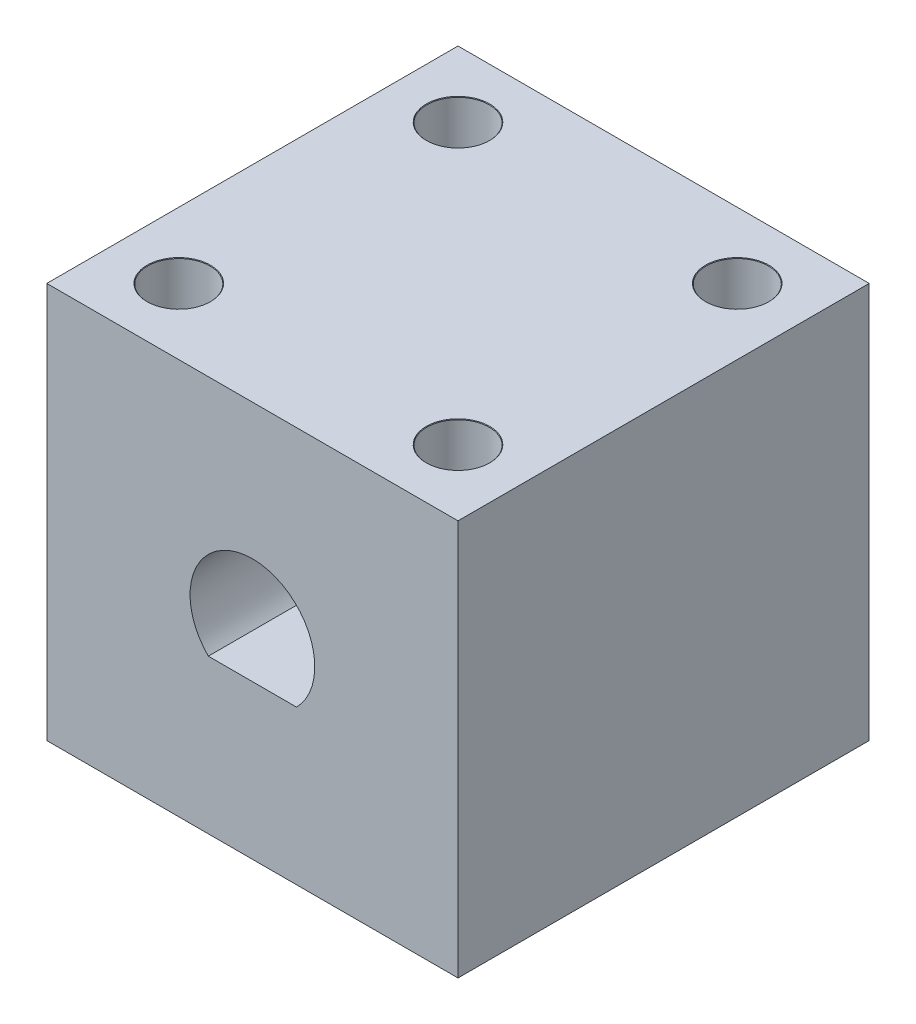
ISO-10303-21;
HEADER;
FILE_DESCRIPTION(('STEP AP214'),'2;1');
FILE_NAME('part.step','',(''),(''),'','','');
FILE_SCHEMA(('AUTOMOTIVE_DESIGN { 1 0 10303 214 1 1 1 1 }'));
ENDSEC;
DATA;
#1=APPLICATION_CONTEXT('core data for automotive mechanical design processes');
#2=APPLICATION_PROTOCOL_DEFINITION('international standard','automotive_design',2000,#1);
#3=PRODUCT_CONTEXT('',#1,'mechanical');
#4=PRODUCT('Part','Part','',(#3));
#5=PRODUCT_RELATED_PRODUCT_CATEGORY('part','',(#4));
#6=PRODUCT_DEFINITION_FORMATION('','',#4);
#7=PRODUCT_DEFINITION_CONTEXT('part definition',#1,'design');
#8=PRODUCT_DEFINITION('design','',#6,#7);
#9=PRODUCT_DEFINITION_SHAPE('','',#8);
#10=(LENGTH_UNIT() NAMED_UNIT(*) SI_UNIT(.MILLI.,.METRE.));
#11=(NAMED_UNIT(*) PLANE_ANGLE_UNIT() SI_UNIT($,.RADIAN.));
#12=(NAMED_UNIT(*) SI_UNIT($,.STERADIAN.) SOLID_ANGLE_UNIT());
#13=UNCERTAINTY_MEASURE_WITH_UNIT(LENGTH_MEASURE(1.E-05),#10,'distance_accuracy_value','');
#14=(GEOMETRIC_REPRESENTATION_CONTEXT(3) GLOBAL_UNCERTAINTY_ASSIGNED_CONTEXT((#13)) GLOBAL_UNIT_ASSIGNED_CONTEXT((#10,
#11,#12)) REPRESENTATION_CONTEXT('',''));
#15=CARTESIAN_POINT('',(0.,0.,0.));
#16=DIRECTION('',(0.,0.,1.));
#17=DIRECTION('',(1.,0.,0.));
#18=AXIS2_PLACEMENT_3D('',#15,#16,#17);
#19=CARTESIAN_POINT('',(472.707485578728,66.6749999999999,-304.699971157455));
#20=DIRECTION('',(0.,0.,-1.));
#21=DIRECTION('',(-1.,0.,0.));
#22=AXIS2_PLACEMENT_3D('',#19,#20,#21);
#23=PLANE('',#22);
#24=CARTESIAN_POINT('',(482.6,57.15,-304.699971157455));
#25=DIRECTION('',(0.,0.,-1.));
#26=DIRECTION('',(-1.,0.,0.));
#27=AXIS2_PLACEMENT_3D('',#24,#25,#26);
#28=CIRCLE('',#27,2.99999999999999);
#29=CARTESIAN_POINT('',(480.47867965644,55.0286796564404,-304.699971157455));
#30=VERTEX_POINT('',#29);
#31=CARTESIAN_POINT('',(484.72132034356,55.0286796564404,-304.699971157455));
#32=VERTEX_POINT('',#31);
#33=EDGE_CURVE('E112',#30,#32,#28,.T.);
#34=ORIENTED_EDGE('',*,*,#33,.T.);
#35=DIRECTION('',(-1.,0.,0.));
#36=VECTOR('',#35,1.);
#37=CARTESIAN_POINT('',(472.707485578728,55.0286796564404,-304.699971157455));
#38=LINE('',#37,#36);
#39=EDGE_CURVE('E99',#32,#30,#38,.T.);
#40=ORIENTED_EDGE('',*,*,#39,.T.);
#41=EDGE_LOOP('',(#34,#40));
#42=FACE_BOUND('',#41,.T.);
#43=DIRECTION('',(1.,0.,0.));
#44=VECTOR('',#43,1.);
#45=CARTESIAN_POINT('',(472.707485578728,47.6249999999999,-304.699971157455));
#46=LINE('',#45,#44);
#47=CARTESIAN_POINT('',(472.707485578728,47.6249999999999,-304.699971157455));
#48=VERTEX_POINT('',#47);
#49=CARTESIAN_POINT('',(492.492514421272,47.6249999999999,-304.699971157455));
#50=VERTEX_POINT('',#49);
#51=EDGE_CURVE('E154',#48,#50,#46,.T.);
#52=ORIENTED_EDGE('',*,*,#51,.T.);
#53=DIRECTION('',(0.,-1.,0.));
#54=VECTOR('',#53,1.);
#55=CARTESIAN_POINT('',(492.492514421272,66.6749999999999,-304.699971157455));
#56=LINE('',#55,#54);
#57=CARTESIAN_POINT('',(492.492514421272,66.6749999999999,-304.699971157455));
#58=VERTEX_POINT('',#57);
#59=EDGE_CURVE('E11',#58,#50,#56,.T.);
#60=ORIENTED_EDGE('',*,*,#59,.F.);
#61=DIRECTION('',(1.,0.,0.));
#62=VECTOR('',#61,1.);
#63=CARTESIAN_POINT('',(472.707485578728,66.6749999999999,-304.699971157455));
#64=LINE('',#63,#62);
#65=CARTESIAN_POINT('',(472.707485578728,66.6749999999999,-304.699971157455));
#66=VERTEX_POINT('',#65);
#67=EDGE_CURVE('E143',#66,#58,#64,.T.);
#68=ORIENTED_EDGE('',*,*,#67,.F.);
#69=DIRECTION('',(0.,-1.,0.));
#70=VECTOR('',#69,1.);
#71=CARTESIAN_POINT('',(472.707485578728,66.6749999999999,-304.699971157455));
#72=LINE('',#71,#70);
#73=EDGE_CURVE('E153',#66,#48,#72,.T.);
#74=ORIENTED_EDGE('',*,*,#73,.T.);
#75=EDGE_LOOP('',(#52,#60,#68,#74));
#76=FACE_BOUND('',#75,.T.);
#77=ADVANCED_FACE('F45',(#42,#76),#23,.F.);
#78=CARTESIAN_POINT('',(492.492514421272,66.6749999999999,-304.699971157455));
#79=DIRECTION('',(-1.,0.,0.));
#80=DIRECTION('',(0.,0.,1.));
#81=AXIS2_PLACEMENT_3D('',#78,#79,#80);
#82=PLANE('',#81);
#83=DIRECTION('',(0.,0.,-1.));
#84=VECTOR('',#83,1.);
#85=CARTESIAN_POINT('',(492.492514421272,47.6249999999999,-304.699971157455));
#86=LINE('',#85,#84);
#87=CARTESIAN_POINT('',(492.492514421272,47.6249999999999,-324.485));
#88=VERTEX_POINT('',#87);
#89=EDGE_CURVE('E157',#50,#88,#86,.T.);
#90=ORIENTED_EDGE('',*,*,#89,.T.);
#91=DIRECTION('',(0.,-1.,0.));
#92=VECTOR('',#91,1.);
#93=CARTESIAN_POINT('',(492.492514421272,66.6749999999999,-324.485));
#94=LINE('',#93,#92);
#95=CARTESIAN_POINT('',(492.492514421272,66.6749999999999,-324.485));
#96=VERTEX_POINT('',#95);
#97=EDGE_CURVE('E53',#96,#88,#94,.T.);
#98=ORIENTED_EDGE('',*,*,#97,.F.);
#99=DIRECTION('',(0.,0.,-1.));
#100=VECTOR('',#99,1.);
#101=CARTESIAN_POINT('',(492.492514421272,66.6749999999999,-304.699971157455));
#102=LINE('',#101,#100);
#103=EDGE_CURVE('E146',#58,#96,#102,.T.);
#104=ORIENTED_EDGE('',*,*,#103,.F.);
#105=ORIENTED_EDGE('',*,*,#59,.T.);
#106=EDGE_LOOP('',(#90,#98,#104,#105));
#107=FACE_BOUND('',#106,.T.);
#108=ADVANCED_FACE('F195',(#107),#82,.F.);
#109=CARTESIAN_POINT('',(472.707485578728,66.6749999999999,-324.485));
#110=DIRECTION('',(0.,0.,1.));
#111=DIRECTION('',(1.,0.,0.));
#112=AXIS2_PLACEMENT_3D('',#109,#110,#111);
#113=PLANE('',#112);
#114=CARTESIAN_POINT('',(482.6,57.15,-324.485));
#115=DIRECTION('',(0.,0.,1.));
#116=DIRECTION('',(1.,0.,0.));
#117=AXIS2_PLACEMENT_3D('',#114,#115,#116);
#118=CIRCLE('',#117,2.99999999999999);
#119=CARTESIAN_POINT('',(484.72132034356,55.0286796564403,-324.485));
#120=VERTEX_POINT('',#119);
#121=CARTESIAN_POINT('',(480.47867965644,55.0286796564404,-324.485));
#122=VERTEX_POINT('',#121);
#123=EDGE_CURVE('E102',#120,#122,#118,.T.);
#124=ORIENTED_EDGE('',*,*,#123,.T.);
#125=DIRECTION('',(1.,0.,0.));
#126=VECTOR('',#125,1.);
#127=CARTESIAN_POINT('',(4.50000598645352E-13,55.0286796564443,-324.485));
#128=LINE('',#127,#126);
#129=EDGE_CURVE('E68',#122,#120,#128,.T.);
#130=ORIENTED_EDGE('',*,*,#129,.T.);
#131=EDGE_LOOP('',(#124,#130));
#132=FACE_BOUND('',#131,.T.);
#133=DIRECTION('',(-1.,0.,0.));
#134=VECTOR('',#133,1.);
#135=CARTESIAN_POINT('',(472.707485578728,47.6249999999999,-324.485));
#136=LINE('',#135,#134);
#137=CARTESIAN_POINT('',(472.707485578728,47.6249999999999,-324.485));
#138=VERTEX_POINT('',#137);
#139=EDGE_CURVE('E159',#88,#138,#136,.T.);
#140=ORIENTED_EDGE('',*,*,#139,.T.);
#141=DIRECTION('',(0.,-1.,0.));
#142=VECTOR('',#141,1.);
#143=CARTESIAN_POINT('',(472.707485578728,66.6749999999999,-324.485));
#144=LINE('',#143,#142);
#145=CARTESIAN_POINT('',(472.707485578728,66.6749999999999,-324.485));
#146=VERTEX_POINT('',#145);
#147=EDGE_CURVE('E164',#146,#138,#144,.T.);
#148=ORIENTED_EDGE('',*,*,#147,.F.);
#149=DIRECTION('',(-1.,0.,0.));
#150=VECTOR('',#149,1.);
#151=CARTESIAN_POINT('',(472.707485578728,66.6749999999999,-324.485));
#152=LINE('',#151,#150);
#153=EDGE_CURVE('E149',#96,#146,#152,.T.);
#154=ORIENTED_EDGE('',*,*,#153,.F.);
#155=ORIENTED_EDGE('',*,*,#97,.T.);
#156=EDGE_LOOP('',(#140,#148,#154,#155));
#157=FACE_BOUND('',#156,.T.);
#158=ADVANCED_FACE('F108',(#132,#157),#113,.F.);
#159=CARTESIAN_POINT('',(472.707485578728,66.6749999999999,-304.699971157455));
#160=DIRECTION('',(1.,0.,0.));
#161=DIRECTION('',(0.,0.,-1.));
#162=AXIS2_PLACEMENT_3D('',#159,#160,#161);
#163=PLANE('',#162);
#164=DIRECTION('',(0.,0.,1.));
#165=VECTOR('',#164,1.);
#166=CARTESIAN_POINT('',(472.707485578728,47.6249999999999,-304.699971157455));
#167=LINE('',#166,#165);
#168=EDGE_CURVE('E147',#138,#48,#167,.T.);
#169=ORIENTED_EDGE('',*,*,#168,.T.);
#170=ORIENTED_EDGE('',*,*,#73,.F.);
#171=DIRECTION('',(0.,0.,1.));
#172=VECTOR('',#171,1.);
#173=CARTESIAN_POINT('',(472.707485578728,66.6749999999999,-304.699971157455));
#174=LINE('',#173,#172);
#175=EDGE_CURVE('E151',#146,#66,#174,.T.);
#176=ORIENTED_EDGE('',*,*,#175,.F.);
#177=ORIENTED_EDGE('',*,*,#147,.T.);
#178=EDGE_LOOP('',(#169,#170,#176,#177));
#179=FACE_BOUND('',#178,.T.);
#180=ADVANCED_FACE('F218',(#179),#163,.F.);
#181=CARTESIAN_POINT('',(0.,66.6749999999999,0.));
#182=DIRECTION('',(0.,1.,0.));
#183=DIRECTION('',(0.,0.,1.));
#184=AXIS2_PLACEMENT_3D('',#181,#182,#183);
#185=PLANE('',#184);
#186=CARTESIAN_POINT('',(475.882485578728,66.6749999999999,-321.31));
#187=DIRECTION('',(0.,1.,0.));
#188=DIRECTION('',(0.,0.,1.));
#189=AXIS2_PLACEMENT_3D('',#186,#187,#188);
#190=CIRCLE('',#189,1.525);
#191=CARTESIAN_POINT('',(475.882485578728,66.6749999999999,-319.785));
#192=VERTEX_POINT('',#191);
#193=EDGE_CURVE('E116',#192,#192,#190,.T.);
#194=ORIENTED_EDGE('',*,*,#193,.F.);
#195=EDGE_LOOP('',(#194));
#196=FACE_BOUND('',#195,.T.);
#197=CARTESIAN_POINT('',(489.317514421272,66.6749999999999,-321.31));
#198=DIRECTION('',(0.,1.,0.));
#199=DIRECTION('',(0.,0.,1.));
#200=AXIS2_PLACEMENT_3D('',#197,#198,#199);
#201=CIRCLE('',#200,1.525);
#202=CARTESIAN_POINT('',(489.317514421272,66.6749999999999,-319.785));
#203=VERTEX_POINT('',#202);
#204=EDGE_CURVE('E122',#203,#203,#201,.T.);
#205=ORIENTED_EDGE('',*,*,#204,.F.);
#206=EDGE_LOOP('',(#205));
#207=FACE_BOUND('',#206,.T.);
#208=CARTESIAN_POINT('',(489.317514421272,66.6749999999999,-307.874971157455));
#209=DIRECTION('',(0.,1.,0.));
#210=DIRECTION('',(0.,0.,1.));
#211=AXIS2_PLACEMENT_3D('',#208,#209,#210);
#212=CIRCLE('',#211,1.525);
#213=CARTESIAN_POINT('',(489.317514421272,66.6749999999999,-306.349971157456));
#214=VERTEX_POINT('',#213);
#215=EDGE_CURVE('E129',#214,#214,#212,.T.);
#216=ORIENTED_EDGE('',*,*,#215,.F.);
#217=EDGE_LOOP('',(#216));
#218=FACE_BOUND('',#217,.T.);
#219=CARTESIAN_POINT('',(475.882485578728,66.6749999999999,-307.874971157455));
#220=DIRECTION('',(0.,1.,0.));
#221=DIRECTION('',(0.,0.,1.));
#222=AXIS2_PLACEMENT_3D('',#219,#220,#221);
#223=CIRCLE('',#222,1.525);
#224=CARTESIAN_POINT('',(475.882485578728,66.6749999999999,-306.349971157456));
#225=VERTEX_POINT('',#224);
#226=EDGE_CURVE('E136',#225,#225,#223,.T.);
#227=ORIENTED_EDGE('',*,*,#226,.F.);
#228=EDGE_LOOP('',(#227));
#229=FACE_BOUND('',#228,.T.);
#230=ORIENTED_EDGE('',*,*,#67,.T.);
#231=ORIENTED_EDGE('',*,*,#103,.T.);
#232=ORIENTED_EDGE('',*,*,#153,.T.);
#233=ORIENTED_EDGE('',*,*,#175,.T.);
#234=EDGE_LOOP('',(#230,#231,#232,#233));
#235=FACE_BOUND('',#234,.T.);
#236=ADVANCED_FACE('F214',(#196,#207,#218,#229,#235),#185,.T.);
#237=CARTESIAN_POINT('',(0.,47.6249999999999,0.));
#238=DIRECTION('',(0.,1.,0.));
#239=DIRECTION('',(0.,0.,1.));
#240=AXIS2_PLACEMENT_3D('',#237,#238,#239);
#241=PLANE('',#240);
#242=CARTESIAN_POINT('',(475.882485578728,47.6249999999999,-321.31));
#243=DIRECTION('',(0.,1.,0.));
#244=DIRECTION('',(0.,0.,1.));
#245=AXIS2_PLACEMENT_3D('',#242,#243,#244);
#246=CIRCLE('',#245,1.5);
#247=CARTESIAN_POINT('',(475.882485578728,47.6249999999999,-319.81));
#248=VERTEX_POINT('',#247);
#249=EDGE_CURVE('E48',#248,#248,#246,.T.);
#250=ORIENTED_EDGE('',*,*,#249,.T.);
#251=EDGE_LOOP('',(#250));
#252=FACE_BOUND('',#251,.T.);
#253=CARTESIAN_POINT('',(489.317514421272,47.6249999999999,-321.31));
#254=DIRECTION('',(0.,1.,0.));
#255=DIRECTION('',(0.,0.,1.));
#256=AXIS2_PLACEMENT_3D('',#253,#254,#255);
#257=CIRCLE('',#256,1.5);
#258=CARTESIAN_POINT('',(489.317514421272,47.6249999999999,-319.81));
#259=VERTEX_POINT('',#258);
#260=EDGE_CURVE('E128',#259,#259,#257,.T.);
#261=ORIENTED_EDGE('',*,*,#260,.T.);
#262=EDGE_LOOP('',(#261));
#263=FACE_BOUND('',#262,.T.);
#264=CARTESIAN_POINT('',(489.317514421272,47.6249999999999,-307.874971157455));
#265=DIRECTION('',(0.,1.,0.));
#266=DIRECTION('',(0.,0.,1.));
#267=AXIS2_PLACEMENT_3D('',#264,#265,#266);
#268=CIRCLE('',#267,1.5);
#269=CARTESIAN_POINT('',(489.317514421272,47.6249999999999,-306.374971157455));
#270=VERTEX_POINT('',#269);
#271=EDGE_CURVE('E135',#270,#270,#268,.T.);
#272=ORIENTED_EDGE('',*,*,#271,.T.);
#273=EDGE_LOOP('',(#272));
#274=FACE_BOUND('',#273,.T.);
#275=CARTESIAN_POINT('',(475.882485578728,47.6249999999999,-307.874971157455));
#276=DIRECTION('',(0.,1.,0.));
#277=DIRECTION('',(0.,0.,1.));
#278=AXIS2_PLACEMENT_3D('',#275,#276,#277);
#279=CIRCLE('',#278,1.5);
#280=CARTESIAN_POINT('',(475.882485578728,47.6249999999999,-306.374971157455));
#281=VERTEX_POINT('',#280);
#282=EDGE_CURVE('E142',#281,#281,#279,.T.);
#283=ORIENTED_EDGE('',*,*,#282,.T.);
#284=EDGE_LOOP('',(#283));
#285=FACE_BOUND('',#284,.T.);
#286=ORIENTED_EDGE('',*,*,#51,.F.);
#287=ORIENTED_EDGE('',*,*,#168,.F.);
#288=ORIENTED_EDGE('',*,*,#139,.F.);
#289=ORIENTED_EDGE('',*,*,#89,.F.);
#290=EDGE_LOOP('',(#286,#287,#288,#289));
#291=FACE_BOUND('',#290,.T.);
#292=ADVANCED_FACE('F175',(#252,#263,#274,#285,#291),#241,.F.);
#293=CARTESIAN_POINT('',(475.882485578728,66.6749999999999,-307.874971157455));
#294=DIRECTION('',(0.,1.,0.));
#295=DIRECTION('',(0.,0.,1.));
#296=AXIS2_PLACEMENT_3D('',#293,#294,#295);
#297=CYLINDRICAL_SURFACE('',#296,1.5);
#298=CARTESIAN_POINT('',(475.882485578728,66.6499999999999,-307.874971157455));
#299=DIRECTION('',(0.,1.,0.));
#300=DIRECTION('',(0.,0.,1.));
#301=AXIS2_PLACEMENT_3D('',#298,#299,#300);
#302=CIRCLE('',#301,1.5);
#303=CARTESIAN_POINT('',(475.882485578728,66.6499999999999,-306.374971157455));
#304=VERTEX_POINT('',#303);
#305=EDGE_CURVE('E139',#304,#304,#302,.T.);
#306=ORIENTED_EDGE('',*,*,#305,.T.);
#307=EDGE_LOOP('',(#306));
#308=FACE_BOUND('',#307,.T.);
#309=ORIENTED_EDGE('',*,*,#282,.F.);
#310=EDGE_LOOP('',(#309));
#311=FACE_BOUND('',#310,.T.);
#312=ADVANCED_FACE('F228',(#308,#311),#297,.F.);
#313=CARTESIAN_POINT('',(475.882485578728,66.6749999999999,-307.874971157455));
#314=DIRECTION('',(0.,1.,0.));
#315=DIRECTION('',(0.,0.,1.));
#316=AXIS2_PLACEMENT_3D('',#313,#314,#315);
#317=CONICAL_SURFACE('',#316,1.525,0.785398163397171);
#318=ORIENTED_EDGE('',*,*,#305,.F.);
#319=EDGE_LOOP('',(#318));
#320=FACE_BOUND('',#319,.T.);
#321=ORIENTED_EDGE('',*,*,#226,.T.);
#322=EDGE_LOOP('',(#321));
#323=FACE_BOUND('',#322,.T.);
#324=ADVANCED_FACE('F235',(#320,#323),#317,.F.);
#325=CARTESIAN_POINT('',(489.317514421272,66.6749999999999,-307.874971157455));
#326=DIRECTION('',(0.,1.,0.));
#327=DIRECTION('',(0.,0.,1.));
#328=AXIS2_PLACEMENT_3D('',#325,#326,#327);
#329=CYLINDRICAL_SURFACE('',#328,1.5);
#330=CARTESIAN_POINT('',(489.317514421272,66.6499999999999,-307.874971157455));
#331=DIRECTION('',(0.,1.,0.));
#332=DIRECTION('',(0.,0.,1.));
#333=AXIS2_PLACEMENT_3D('',#330,#331,#332);
#334=CIRCLE('',#333,1.5);
#335=CARTESIAN_POINT('',(489.317514421272,66.6499999999999,-306.374971157455));
#336=VERTEX_POINT('',#335);
#337=EDGE_CURVE('E132',#336,#336,#334,.T.);
#338=ORIENTED_EDGE('',*,*,#337,.T.);
#339=EDGE_LOOP('',(#338));
#340=FACE_BOUND('',#339,.T.);
#341=ORIENTED_EDGE('',*,*,#271,.F.);
#342=EDGE_LOOP('',(#341));
#343=FACE_BOUND('',#342,.T.);
#344=ADVANCED_FACE('F191',(#340,#343),#329,.F.);
#345=CARTESIAN_POINT('',(489.317514421272,66.6749999999999,-307.874971157455));
#346=DIRECTION('',(0.,1.,0.));
#347=DIRECTION('',(0.,0.,1.));
#348=AXIS2_PLACEMENT_3D('',#345,#346,#347);
#349=CONICAL_SURFACE('',#348,1.525,0.785398163397171);
#350=ORIENTED_EDGE('',*,*,#337,.F.);
#351=EDGE_LOOP('',(#350));
#352=FACE_BOUND('',#351,.T.);
#353=ORIENTED_EDGE('',*,*,#215,.T.);
#354=EDGE_LOOP('',(#353));
#355=FACE_BOUND('',#354,.T.);
#356=ADVANCED_FACE('F181',(#352,#355),#349,.F.);
#357=CARTESIAN_POINT('',(489.317514421272,66.6749999999999,-321.31));
#358=DIRECTION('',(0.,1.,0.));
#359=DIRECTION('',(0.,0.,1.));
#360=AXIS2_PLACEMENT_3D('',#357,#358,#359);
#361=CYLINDRICAL_SURFACE('',#360,1.5);
#362=CARTESIAN_POINT('',(489.317514421272,66.6499999999999,-321.31));
#363=DIRECTION('',(0.,1.,0.));
#364=DIRECTION('',(0.,0.,1.));
#365=AXIS2_PLACEMENT_3D('',#362,#363,#364);
#366=CIRCLE('',#365,1.5);
#367=CARTESIAN_POINT('',(489.317514421272,66.6499999999999,-319.81));
#368=VERTEX_POINT('',#367);
#369=EDGE_CURVE('E125',#368,#368,#366,.T.);
#370=ORIENTED_EDGE('',*,*,#369,.T.);
#371=EDGE_LOOP('',(#370));
#372=FACE_BOUND('',#371,.T.);
#373=ORIENTED_EDGE('',*,*,#260,.F.);
#374=EDGE_LOOP('',(#373));
#375=FACE_BOUND('',#374,.T.);
#376=ADVANCED_FACE('F178',(#372,#375),#361,.F.);
#377=CARTESIAN_POINT('',(489.317514421272,66.6749999999999,-321.31));
#378=DIRECTION('',(0.,1.,0.));
#379=DIRECTION('',(0.,0.,1.));
#380=AXIS2_PLACEMENT_3D('',#377,#378,#379);
#381=CONICAL_SURFACE('',#380,1.525,0.785398163397171);
#382=ORIENTED_EDGE('',*,*,#369,.F.);
#383=EDGE_LOOP('',(#382));
#384=FACE_BOUND('',#383,.T.);
#385=ORIENTED_EDGE('',*,*,#204,.T.);
#386=EDGE_LOOP('',(#385));
#387=FACE_BOUND('',#386,.T.);
#388=ADVANCED_FACE('F180',(#384,#387),#381,.F.);
#389=CARTESIAN_POINT('',(475.882485578728,66.6749999999999,-321.31));
#390=DIRECTION('',(0.,1.,0.));
#391=DIRECTION('',(0.,0.,1.));
#392=AXIS2_PLACEMENT_3D('',#389,#390,#391);
#393=CYLINDRICAL_SURFACE('',#392,1.5);
#394=CARTESIAN_POINT('',(475.882485578728,66.6499999999999,-321.31));
#395=DIRECTION('',(0.,1.,0.));
#396=DIRECTION('',(0.,0.,1.));
#397=AXIS2_PLACEMENT_3D('',#394,#395,#396);
#398=CIRCLE('',#397,1.5);
#399=CARTESIAN_POINT('',(475.882485578728,66.6499999999999,-319.81));
#400=VERTEX_POINT('',#399);
#401=EDGE_CURVE('E119',#400,#400,#398,.T.);
#402=ORIENTED_EDGE('',*,*,#401,.T.);
#403=EDGE_LOOP('',(#402));
#404=FACE_BOUND('',#403,.T.);
#405=ORIENTED_EDGE('',*,*,#249,.F.);
#406=EDGE_LOOP('',(#405));
#407=FACE_BOUND('',#406,.T.);
#408=ADVANCED_FACE('F188',(#404,#407),#393,.F.);
#409=CARTESIAN_POINT('',(475.882485578728,66.6749999999999,-321.31));
#410=DIRECTION('',(0.,1.,0.));
#411=DIRECTION('',(0.,0.,1.));
#412=AXIS2_PLACEMENT_3D('',#409,#410,#411);
#413=CONICAL_SURFACE('',#412,1.525,0.785398163397171);
#414=ORIENTED_EDGE('',*,*,#401,.F.);
#415=EDGE_LOOP('',(#414));
#416=FACE_BOUND('',#415,.T.);
#417=ORIENTED_EDGE('',*,*,#193,.T.);
#418=EDGE_LOOP('',(#417));
#419=FACE_BOUND('',#418,.T.);
#420=ADVANCED_FACE('F283',(#416,#419),#413,.F.);
#421=CARTESIAN_POINT('',(4.50000598645352E-13,55.0286796564443,-324.485));
#422=DIRECTION('',(0.,-1.,0.));
#423=DIRECTION('',(1.,0.,0.));
#424=AXIS2_PLACEMENT_3D('',#421,#422,#423);
#425=PLANE('',#424);
#426=DIRECTION('',(0.,0.,1.));
#427=VECTOR('',#426,1.);
#428=CARTESIAN_POINT('',(484.72132034356,55.0286796564403,-324.485));
#429=LINE('',#428,#427);
#430=EDGE_CURVE('E61',#120,#32,#429,.T.);
#431=ORIENTED_EDGE('',*,*,#430,.F.);
#432=ORIENTED_EDGE('',*,*,#129,.F.);
#433=DIRECTION('',(0.,0.,1.));
#434=VECTOR('',#433,1.);
#435=CARTESIAN_POINT('',(480.47867965644,55.0286796564404,-324.485));
#436=LINE('',#435,#434);
#437=EDGE_CURVE('E101',#122,#30,#436,.T.);
#438=ORIENTED_EDGE('',*,*,#437,.T.);
#439=ORIENTED_EDGE('',*,*,#39,.F.);
#440=EDGE_LOOP('',(#431,#432,#438,#439));
#441=FACE_BOUND('',#440,.T.);
#442=ADVANCED_FACE('F97',(#441),#425,.F.);
#443=CARTESIAN_POINT('',(482.6,57.15,-324.485));
#444=DIRECTION('',(0.,0.,1.));
#445=DIRECTION('',(1.,0.,0.));
#446=AXIS2_PLACEMENT_3D('',#443,#444,#445);
#447=CYLINDRICAL_SURFACE('',#446,2.99999999999999);
#448=ORIENTED_EDGE('',*,*,#437,.F.);
#449=ORIENTED_EDGE('',*,*,#123,.F.);
#450=ORIENTED_EDGE('',*,*,#430,.T.);
#451=ORIENTED_EDGE('',*,*,#33,.F.);
#452=EDGE_LOOP('',(#448,#449,#450,#451));
#453=FACE_BOUND('',#452,.T.);
#454=ADVANCED_FACE('F105',(#453),#447,.F.);
#455=CLOSED_SHELL('',(#77,#108,#158,#180,#236,#292,#312,#324,#344,#356,#376,#388,#408,#420,#442,#454));
#456=MANIFOLD_SOLID_BREP('B2',#455);
#457=ADVANCED_BREP_SHAPE_REPRESENTATION('',(#18,#456),#14);
#458=SHAPE_DEFINITION_REPRESENTATION(#9,#457);
ENDSEC;
END-ISO-10303-21;
